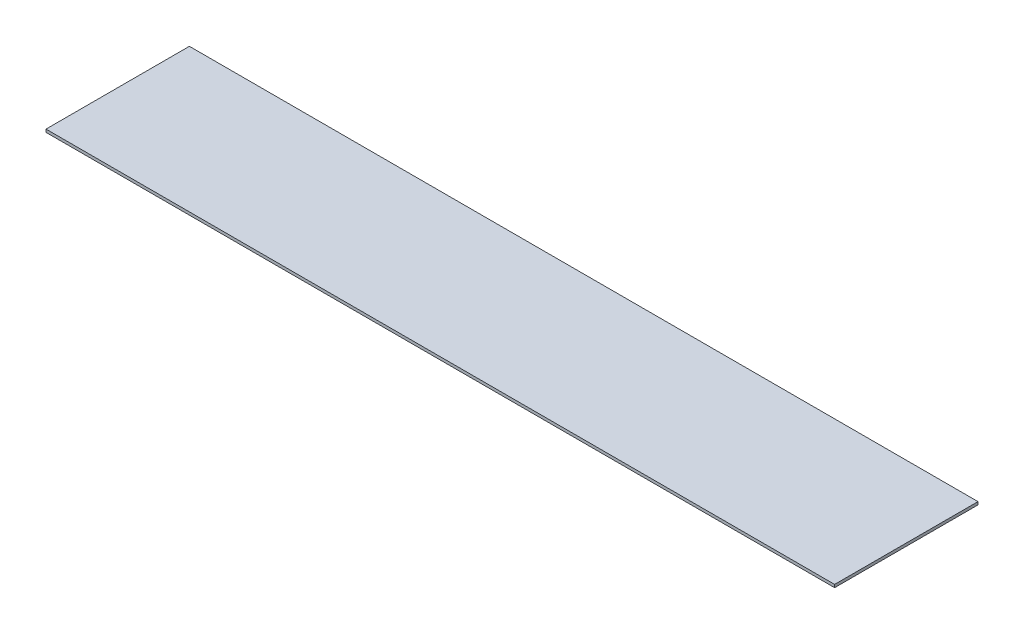
ISO-10303-21;
HEADER;
FILE_DESCRIPTION(('STEP AP214'),'2;1');
FILE_NAME('part.step','',(''),(''),'','','');
FILE_SCHEMA(('AUTOMOTIVE_DESIGN { 1 0 10303 214 1 1 1 1 }'));
ENDSEC;
DATA;
#1=APPLICATION_CONTEXT('core data for automotive mechanical design processes');
#2=APPLICATION_PROTOCOL_DEFINITION('international standard','automotive_design',2000,#1);
#3=PRODUCT_CONTEXT('',#1,'mechanical');
#4=PRODUCT('Part','Part','',(#3));
#5=PRODUCT_RELATED_PRODUCT_CATEGORY('part','',(#4));
#6=PRODUCT_DEFINITION_FORMATION('','',#4);
#7=PRODUCT_DEFINITION_CONTEXT('part definition',#1,'design');
#8=PRODUCT_DEFINITION('design','',#6,#7);
#9=PRODUCT_DEFINITION_SHAPE('','',#8);
#10=(LENGTH_UNIT() NAMED_UNIT(*) SI_UNIT(.MILLI.,.METRE.));
#11=(NAMED_UNIT(*) PLANE_ANGLE_UNIT() SI_UNIT($,.RADIAN.));
#12=(NAMED_UNIT(*) SI_UNIT($,.STERADIAN.) SOLID_ANGLE_UNIT());
#13=UNCERTAINTY_MEASURE_WITH_UNIT(LENGTH_MEASURE(1.E-05),#10,'distance_accuracy_value','');
#14=(GEOMETRIC_REPRESENTATION_CONTEXT(3) GLOBAL_UNCERTAINTY_ASSIGNED_CONTEXT((#13)) GLOBAL_UNIT_ASSIGNED_CONTEXT((#10,
#11,#12)) REPRESENTATION_CONTEXT('',''));
#15=CARTESIAN_POINT('',(0.,0.,0.));
#16=DIRECTION('',(0.,0.,1.));
#17=DIRECTION('',(1.,0.,0.));
#18=AXIS2_PLACEMENT_3D('',#15,#16,#17);
#19=CARTESIAN_POINT('',(34.925,0.254,6.35));
#20=DIRECTION('',(-1.,0.,0.));
#21=DIRECTION('',(0.,0.,1.));
#22=AXIS2_PLACEMENT_3D('',#19,#20,#21);
#23=PLANE('',#22);
#24=DIRECTION('',(0.,0.,-1.));
#25=VECTOR('',#24,1.);
#26=CARTESIAN_POINT('',(34.925,0.,6.35));
#27=LINE('',#26,#25);
#28=CARTESIAN_POINT('',(34.925,0.,6.35));
#29=VERTEX_POINT('',#28);
#30=CARTESIAN_POINT('',(34.925,0.,-6.35));
#31=VERTEX_POINT('',#30);
#32=EDGE_CURVE('E96',#29,#31,#27,.T.);
#33=ORIENTED_EDGE('',*,*,#32,.T.);
#34=DIRECTION('',(0.,-1.,0.));
#35=VECTOR('',#34,1.);
#36=CARTESIAN_POINT('',(34.925,0.254,-6.35));
#37=LINE('',#36,#35);
#38=CARTESIAN_POINT('',(34.925,0.254,-6.35));
#39=VERTEX_POINT('',#38);
#40=EDGE_CURVE('E11',#39,#31,#37,.T.);
#41=ORIENTED_EDGE('',*,*,#40,.F.);
#42=DIRECTION('',(0.,0.,-1.));
#43=VECTOR('',#42,1.);
#44=CARTESIAN_POINT('',(34.925,0.254,6.35));
#45=LINE('',#44,#43);
#46=CARTESIAN_POINT('',(34.925,0.254,6.35));
#47=VERTEX_POINT('',#46);
#48=EDGE_CURVE('E84',#47,#39,#45,.T.);
#49=ORIENTED_EDGE('',*,*,#48,.F.);
#50=DIRECTION('',(0.,-1.,0.));
#51=VECTOR('',#50,1.);
#52=CARTESIAN_POINT('',(34.925,0.254,6.35));
#53=LINE('',#52,#51);
#54=EDGE_CURVE('E92',#47,#29,#53,.T.);
#55=ORIENTED_EDGE('',*,*,#54,.T.);
#56=EDGE_LOOP('',(#33,#41,#49,#55));
#57=FACE_BOUND('',#56,.T.);
#58=ADVANCED_FACE('F33',(#57),#23,.F.);
#59=CARTESIAN_POINT('',(-34.925,0.254,-6.35));
#60=DIRECTION('',(0.,0.,1.));
#61=DIRECTION('',(1.,0.,0.));
#62=AXIS2_PLACEMENT_3D('',#59,#60,#61);
#63=PLANE('',#62);
#64=DIRECTION('',(-1.,0.,0.));
#65=VECTOR('',#64,1.);
#66=CARTESIAN_POINT('',(-34.925,0.,-6.35));
#67=LINE('',#66,#65);
#68=CARTESIAN_POINT('',(-34.925,0.,-6.35));
#69=VERTEX_POINT('',#68);
#70=EDGE_CURVE('E88',#31,#69,#67,.T.);
#71=ORIENTED_EDGE('',*,*,#70,.T.);
#72=DIRECTION('',(0.,-1.,0.));
#73=VECTOR('',#72,1.);
#74=CARTESIAN_POINT('',(-34.925,0.254,-6.35));
#75=LINE('',#74,#73);
#76=CARTESIAN_POINT('',(-34.925,0.254,-6.35));
#77=VERTEX_POINT('',#76);
#78=EDGE_CURVE('E41',#77,#69,#75,.T.);
#79=ORIENTED_EDGE('',*,*,#78,.F.);
#80=DIRECTION('',(-1.,0.,0.));
#81=VECTOR('',#80,1.);
#82=CARTESIAN_POINT('',(-34.925,0.254,-6.35));
#83=LINE('',#82,#81);
#84=EDGE_CURVE('E79',#39,#77,#83,.T.);
#85=ORIENTED_EDGE('',*,*,#84,.F.);
#86=ORIENTED_EDGE('',*,*,#40,.T.);
#87=EDGE_LOOP('',(#71,#79,#85,#86));
#88=FACE_BOUND('',#87,.T.);
#89=ADVANCED_FACE('F87',(#88),#63,.F.);
#90=CARTESIAN_POINT('',(-34.925,0.254,6.35));
#91=DIRECTION('',(1.,0.,0.));
#92=DIRECTION('',(0.,0.,-1.));
#93=AXIS2_PLACEMENT_3D('',#90,#91,#92);
#94=PLANE('',#93);
#95=DIRECTION('',(0.,0.,1.));
#96=VECTOR('',#95,1.);
#97=CARTESIAN_POINT('',(-34.925,0.,6.35));
#98=LINE('',#97,#96);
#99=CARTESIAN_POINT('',(-34.925,0.,6.35));
#100=VERTEX_POINT('',#99);
#101=EDGE_CURVE('E66',#69,#100,#98,.T.);
#102=ORIENTED_EDGE('',*,*,#101,.T.);
#103=DIRECTION('',(0.,-1.,0.));
#104=VECTOR('',#103,1.);
#105=CARTESIAN_POINT('',(-34.925,0.254,6.35));
#106=LINE('',#105,#104);
#107=CARTESIAN_POINT('',(-34.925,0.254,6.35));
#108=VERTEX_POINT('',#107);
#109=EDGE_CURVE('E89',#108,#100,#106,.T.);
#110=ORIENTED_EDGE('',*,*,#109,.F.);
#111=DIRECTION('',(0.,0.,1.));
#112=VECTOR('',#111,1.);
#113=CARTESIAN_POINT('',(-34.925,0.254,6.35));
#114=LINE('',#113,#112);
#115=EDGE_CURVE('E82',#77,#108,#114,.T.);
#116=ORIENTED_EDGE('',*,*,#115,.F.);
#117=ORIENTED_EDGE('',*,*,#78,.T.);
#118=EDGE_LOOP('',(#102,#110,#116,#117));
#119=FACE_BOUND('',#118,.T.);
#120=ADVANCED_FACE('F90',(#119),#94,.F.);
#121=CARTESIAN_POINT('',(-34.925,0.254,6.35));
#122=DIRECTION('',(0.,0.,-1.));
#123=DIRECTION('',(-1.,0.,0.));
#124=AXIS2_PLACEMENT_3D('',#121,#122,#123);
#125=PLANE('',#124);
#126=DIRECTION('',(1.,0.,0.));
#127=VECTOR('',#126,1.);
#128=CARTESIAN_POINT('',(-34.925,0.,6.35));
#129=LINE('',#128,#127);
#130=EDGE_CURVE('E72',#100,#29,#129,.T.);
#131=ORIENTED_EDGE('',*,*,#130,.T.);
#132=ORIENTED_EDGE('',*,*,#54,.F.);
#133=DIRECTION('',(1.,0.,0.));
#134=VECTOR('',#133,1.);
#135=CARTESIAN_POINT('',(-34.925,0.254,6.35));
#136=LINE('',#135,#134);
#137=EDGE_CURVE('E49',#108,#47,#136,.T.);
#138=ORIENTED_EDGE('',*,*,#137,.F.);
#139=ORIENTED_EDGE('',*,*,#109,.T.);
#140=EDGE_LOOP('',(#131,#132,#138,#139));
#141=FACE_BOUND('',#140,.T.);
#142=ADVANCED_FACE('F103',(#141),#125,.F.);
#143=CARTESIAN_POINT('',(0.,0.254,0.));
#144=DIRECTION('',(0.,-1.,0.));
#145=DIRECTION('',(0.,0.,-1.));
#146=AXIS2_PLACEMENT_3D('',#143,#144,#145);
#147=PLANE('',#146);
#148=ORIENTED_EDGE('',*,*,#48,.T.);
#149=ORIENTED_EDGE('',*,*,#84,.T.);
#150=ORIENTED_EDGE('',*,*,#115,.T.);
#151=ORIENTED_EDGE('',*,*,#137,.T.);
#152=EDGE_LOOP('',(#148,#149,#150,#151));
#153=FACE_BOUND('',#152,.T.);
#154=ADVANCED_FACE('F80',(#153),#147,.F.);
#155=CARTESIAN_POINT('',(0.,0.,0.));
#156=DIRECTION('',(0.,-1.,0.));
#157=DIRECTION('',(0.,0.,-1.));
#158=AXIS2_PLACEMENT_3D('',#155,#156,#157);
#159=PLANE('',#158);
#160=ORIENTED_EDGE('',*,*,#32,.F.);
#161=ORIENTED_EDGE('',*,*,#130,.F.);
#162=ORIENTED_EDGE('',*,*,#101,.F.);
#163=ORIENTED_EDGE('',*,*,#70,.F.);
#164=EDGE_LOOP('',(#160,#161,#162,#163));
#165=FACE_BOUND('',#164,.T.);
#166=ADVANCED_FACE('F106',(#165),#159,.T.);
#167=CLOSED_SHELL('',(#58,#89,#120,#142,#154,#166));
#168=MANIFOLD_SOLID_BREP('B2',#167);
#169=ADVANCED_BREP_SHAPE_REPRESENTATION('',(#18,#168),#14);
#170=SHAPE_DEFINITION_REPRESENTATION(#9,#169);
ENDSEC;
END-ISO-10303-21;
